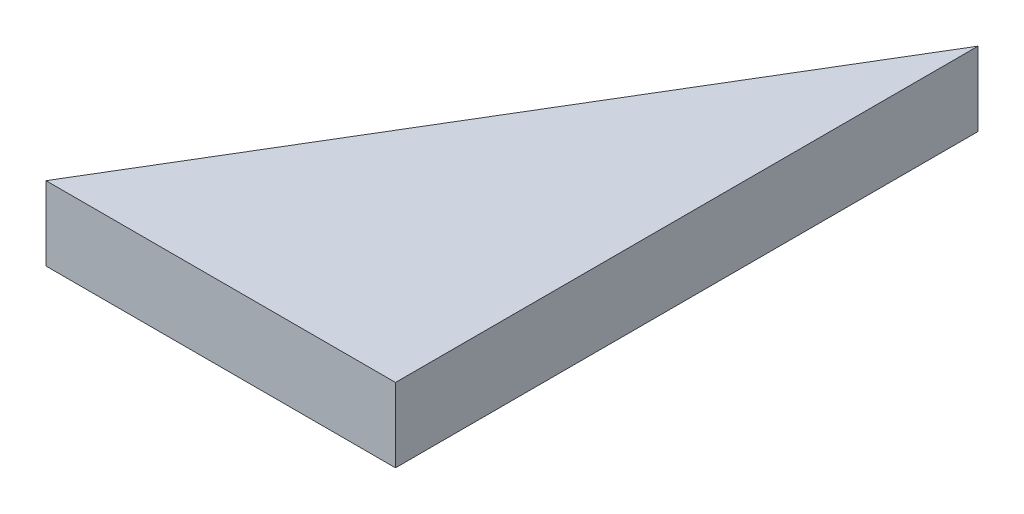
ISO-10303-21;
HEADER;
FILE_DESCRIPTION(('STEP AP214'),'2;1');
FILE_NAME('part.step','',(''),(''),'','','');
FILE_SCHEMA(('AUTOMOTIVE_DESIGN { 1 0 10303 214 1 1 1 1 }'));
ENDSEC;
DATA;
#1=APPLICATION_CONTEXT('core data for automotive mechanical design processes');
#2=APPLICATION_PROTOCOL_DEFINITION('international standard','automotive_design',2000,#1);
#3=PRODUCT_CONTEXT('',#1,'mechanical');
#4=PRODUCT('Part','Part','',(#3));
#5=PRODUCT_RELATED_PRODUCT_CATEGORY('part','',(#4));
#6=PRODUCT_DEFINITION_FORMATION('','',#4);
#7=PRODUCT_DEFINITION_CONTEXT('part definition',#1,'design');
#8=PRODUCT_DEFINITION('design','',#6,#7);
#9=PRODUCT_DEFINITION_SHAPE('','',#8);
#10=(LENGTH_UNIT() NAMED_UNIT(*) SI_UNIT(.MILLI.,.METRE.));
#11=(NAMED_UNIT(*) PLANE_ANGLE_UNIT() SI_UNIT($,.RADIAN.));
#12=(NAMED_UNIT(*) SI_UNIT($,.STERADIAN.) SOLID_ANGLE_UNIT());
#13=UNCERTAINTY_MEASURE_WITH_UNIT(LENGTH_MEASURE(1.E-05),#10,'distance_accuracy_value','');
#14=(GEOMETRIC_REPRESENTATION_CONTEXT(3) GLOBAL_UNCERTAINTY_ASSIGNED_CONTEXT((#13)) GLOBAL_UNIT_ASSIGNED_CONTEXT((#10,
#11,#12)) REPRESENTATION_CONTEXT('',''));
#15=CARTESIAN_POINT('',(0.,0.,0.));
#16=DIRECTION('',(0.,0.,1.));
#17=DIRECTION('',(1.,0.,0.));
#18=AXIS2_PLACEMENT_3D('',#15,#16,#17);
#19=CARTESIAN_POINT('',(0.,6.35,-50.));
#20=DIRECTION('',(0.857492925712544,0.,0.514495755427526));
#21=DIRECTION('',(0.514495755427526,0.,-0.857492925712544));
#22=AXIS2_PLACEMENT_3D('',#19,#20,#21);
#23=PLANE('',#22);
#24=DIRECTION('',(-0.514495755427526,0.,0.857492925712544));
#25=VECTOR('',#24,1.);
#26=CARTESIAN_POINT('',(0.,0.,-50.));
#27=LINE('',#26,#25);
#28=CARTESIAN_POINT('',(0.,0.,-50.));
#29=VERTEX_POINT('',#28);
#30=CARTESIAN_POINT('',(-30.,0.,0.));
#31=VERTEX_POINT('',#30);
#32=EDGE_CURVE('E81',#29,#31,#27,.T.);
#33=ORIENTED_EDGE('',*,*,#32,.T.);
#34=DIRECTION('',(0.,-1.,0.));
#35=VECTOR('',#34,1.);
#36=CARTESIAN_POINT('',(-30.,6.35,0.));
#37=LINE('',#36,#35);
#38=CARTESIAN_POINT('',(-30.,6.35,0.));
#39=VERTEX_POINT('',#38);
#40=EDGE_CURVE('E11',#39,#31,#37,.T.);
#41=ORIENTED_EDGE('',*,*,#40,.F.);
#42=DIRECTION('',(-0.514495755427526,0.,0.857492925712544));
#43=VECTOR('',#42,1.);
#44=CARTESIAN_POINT('',(0.,6.35,-50.));
#45=LINE('',#44,#43);
#46=CARTESIAN_POINT('',(0.,6.35,-50.));
#47=VERTEX_POINT('',#46);
#48=EDGE_CURVE('E74',#47,#39,#45,.T.);
#49=ORIENTED_EDGE('',*,*,#48,.F.);
#50=DIRECTION('',(0.,-1.,0.));
#51=VECTOR('',#50,1.);
#52=CARTESIAN_POINT('',(0.,6.35,-50.));
#53=LINE('',#52,#51);
#54=EDGE_CURVE('E82',#47,#29,#53,.T.);
#55=ORIENTED_EDGE('',*,*,#54,.T.);
#56=EDGE_LOOP('',(#33,#41,#49,#55));
#57=FACE_BOUND('',#56,.T.);
#58=ADVANCED_FACE('F34',(#57),#23,.F.);
#59=CARTESIAN_POINT('',(-30.,6.35,0.));
#60=DIRECTION('',(0.,0.,-1.));
#61=DIRECTION('',(-1.,0.,0.));
#62=AXIS2_PLACEMENT_3D('',#59,#60,#61);
#63=PLANE('',#62);
#64=DIRECTION('',(1.,0.,0.));
#65=VECTOR('',#64,1.);
#66=CARTESIAN_POINT('',(-30.,0.,0.));
#67=LINE('',#66,#65);
#68=CARTESIAN_POINT('',(0.,0.,0.));
#69=VERTEX_POINT('',#68);
#70=EDGE_CURVE('E62',#31,#69,#67,.T.);
#71=ORIENTED_EDGE('',*,*,#70,.T.);
#72=DIRECTION('',(0.,-1.,0.));
#73=VECTOR('',#72,1.);
#74=CARTESIAN_POINT('',(0.,6.35,0.));
#75=LINE('',#74,#73);
#76=CARTESIAN_POINT('',(0.,6.35,0.));
#77=VERTEX_POINT('',#76);
#78=EDGE_CURVE('E42',#77,#69,#75,.T.);
#79=ORIENTED_EDGE('',*,*,#78,.F.);
#80=DIRECTION('',(1.,0.,0.));
#81=VECTOR('',#80,1.);
#82=CARTESIAN_POINT('',(-30.,6.35,0.));
#83=LINE('',#82,#81);
#84=EDGE_CURVE('E70',#39,#77,#83,.T.);
#85=ORIENTED_EDGE('',*,*,#84,.F.);
#86=ORIENTED_EDGE('',*,*,#40,.T.);
#87=EDGE_LOOP('',(#71,#79,#85,#86));
#88=FACE_BOUND('',#87,.T.);
#89=ADVANCED_FACE('F71',(#88),#63,.F.);
#90=CARTESIAN_POINT('',(0.,6.35,0.));
#91=DIRECTION('',(-1.,0.,0.));
#92=DIRECTION('',(0.,0.,1.));
#93=AXIS2_PLACEMENT_3D('',#90,#91,#92);
#94=PLANE('',#93);
#95=DIRECTION('',(0.,0.,-1.));
#96=VECTOR('',#95,1.);
#97=CARTESIAN_POINT('',(0.,0.,0.));
#98=LINE('',#97,#96);
#99=EDGE_CURVE('E67',#69,#29,#98,.T.);
#100=ORIENTED_EDGE('',*,*,#99,.T.);
#101=ORIENTED_EDGE('',*,*,#54,.F.);
#102=DIRECTION('',(0.,0.,-1.));
#103=VECTOR('',#102,1.);
#104=CARTESIAN_POINT('',(0.,6.35,0.));
#105=LINE('',#104,#103);
#106=EDGE_CURVE('E50',#77,#47,#105,.T.);
#107=ORIENTED_EDGE('',*,*,#106,.F.);
#108=ORIENTED_EDGE('',*,*,#78,.T.);
#109=EDGE_LOOP('',(#100,#101,#107,#108));
#110=FACE_BOUND('',#109,.T.);
#111=ADVANCED_FACE('F89',(#110),#94,.F.);
#112=CARTESIAN_POINT('',(0.,6.35,0.));
#113=DIRECTION('',(0.,1.,0.));
#114=DIRECTION('',(0.,0.,1.));
#115=AXIS2_PLACEMENT_3D('',#112,#113,#114);
#116=PLANE('',#115);
#117=ORIENTED_EDGE('',*,*,#48,.T.);
#118=ORIENTED_EDGE('',*,*,#84,.T.);
#119=ORIENTED_EDGE('',*,*,#106,.T.);
#120=EDGE_LOOP('',(#117,#118,#119));
#121=FACE_BOUND('',#120,.T.);
#122=ADVANCED_FACE('F77',(#121),#116,.T.);
#123=CARTESIAN_POINT('',(0.,0.,0.));
#124=DIRECTION('',(0.,1.,0.));
#125=DIRECTION('',(0.,0.,1.));
#126=AXIS2_PLACEMENT_3D('',#123,#124,#125);
#127=PLANE('',#126);
#128=ORIENTED_EDGE('',*,*,#32,.F.);
#129=ORIENTED_EDGE('',*,*,#99,.F.);
#130=ORIENTED_EDGE('',*,*,#70,.F.);
#131=EDGE_LOOP('',(#128,#129,#130));
#132=FACE_BOUND('',#131,.T.);
#133=ADVANCED_FACE('F90',(#132),#127,.F.);
#134=CLOSED_SHELL('',(#58,#89,#111,#122,#133));
#135=MANIFOLD_SOLID_BREP('B2',#134);
#136=ADVANCED_BREP_SHAPE_REPRESENTATION('',(#18,#135),#14);
#137=SHAPE_DEFINITION_REPRESENTATION(#9,#136);
ENDSEC;
END-ISO-10303-21;
